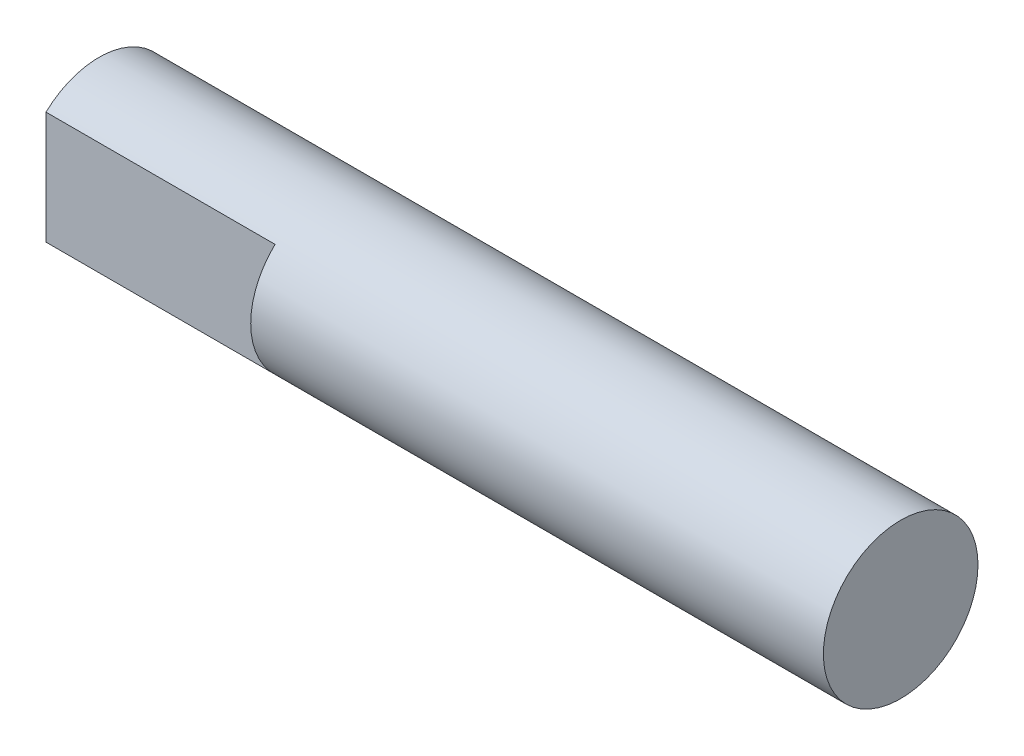
ISO-10303-21;
HEADER;
FILE_DESCRIPTION(('STEP AP214'),'2;1');
FILE_NAME('part.step','',(''),(''),'','','');
FILE_SCHEMA(('AUTOMOTIVE_DESIGN { 1 0 10303 214 1 1 1 1 }'));
ENDSEC;
DATA;
#1=APPLICATION_CONTEXT('core data for automotive mechanical design processes');
#2=APPLICATION_PROTOCOL_DEFINITION('international standard','automotive_design',2000,#1);
#3=PRODUCT_CONTEXT('',#1,'mechanical');
#4=PRODUCT('Part','Part','',(#3));
#5=PRODUCT_RELATED_PRODUCT_CATEGORY('part','',(#4));
#6=PRODUCT_DEFINITION_FORMATION('','',#4);
#7=PRODUCT_DEFINITION_CONTEXT('part definition',#1,'design');
#8=PRODUCT_DEFINITION('design','',#6,#7);
#9=PRODUCT_DEFINITION_SHAPE('','',#8);
#10=(LENGTH_UNIT() NAMED_UNIT(*) SI_UNIT(.MILLI.,.METRE.));
#11=(NAMED_UNIT(*) PLANE_ANGLE_UNIT() SI_UNIT($,.RADIAN.));
#12=(NAMED_UNIT(*) SI_UNIT($,.STERADIAN.) SOLID_ANGLE_UNIT());
#13=UNCERTAINTY_MEASURE_WITH_UNIT(LENGTH_MEASURE(1.E-05),#10,'distance_accuracy_value','');
#14=(GEOMETRIC_REPRESENTATION_CONTEXT(3) GLOBAL_UNCERTAINTY_ASSIGNED_CONTEXT((#13)) GLOBAL_UNIT_ASSIGNED_CONTEXT((#10,
#11,#12)) REPRESENTATION_CONTEXT('',''));
#15=CARTESIAN_POINT('',(0.,0.,0.));
#16=DIRECTION('',(0.,0.,1.));
#17=DIRECTION('',(1.,0.,0.));
#18=AXIS2_PLACEMENT_3D('',#15,#16,#17);
#19=CARTESIAN_POINT('',(18.5,0.,0.));
#20=DIRECTION('',(-1.,0.,0.));
#21=DIRECTION('',(0.,0.,1.));
#22=AXIS2_PLACEMENT_3D('',#19,#20,#21);
#23=CYLINDRICAL_SURFACE('',#22,2.7);
#24=DIRECTION('',(-1.,0.,0.));
#25=VECTOR('',#24,1.);
#26=CARTESIAN_POINT('',(-10.5,1.96659604392971,1.85));
#27=LINE('',#26,#25);
#28=CARTESIAN_POINT('',(-10.5,1.96659604392971,1.85));
#29=VERTEX_POINT('',#28);
#30=CARTESIAN_POINT('',(-18.5,1.96659604392971,1.85));
#31=VERTEX_POINT('',#30);
#32=EDGE_CURVE('E61',#29,#31,#27,.T.);
#33=ORIENTED_EDGE('',*,*,#32,.F.);
#34=CARTESIAN_POINT('',(-10.5,0.,0.));
#35=DIRECTION('',(1.,0.,0.));
#36=DIRECTION('',(0.,0.,-1.));
#37=AXIS2_PLACEMENT_3D('',#34,#35,#36);
#38=CIRCLE('',#37,2.7);
#39=CARTESIAN_POINT('',(-10.5,-1.96659604392971,1.85));
#40=VERTEX_POINT('',#39);
#41=EDGE_CURVE('E84',#29,#40,#38,.T.);
#42=ORIENTED_EDGE('',*,*,#41,.T.);
#43=DIRECTION('',(-1.,0.,0.));
#44=VECTOR('',#43,1.);
#45=CARTESIAN_POINT('',(-10.5,-1.96659604392971,1.85));
#46=LINE('',#45,#44);
#47=CARTESIAN_POINT('',(-18.5,-1.96659604392971,1.85));
#48=VERTEX_POINT('',#47);
#49=EDGE_CURVE('E81',#40,#48,#46,.T.);
#50=ORIENTED_EDGE('',*,*,#49,.T.);
#51=CARTESIAN_POINT('',(-18.5,0.,0.));
#52=DIRECTION('',(1.,0.,0.));
#53=DIRECTION('',(0.,0.,-1.));
#54=AXIS2_PLACEMENT_3D('',#51,#52,#53);
#55=CIRCLE('',#54,2.7);
#56=CARTESIAN_POINT('',(-18.5,-1.96659604392971,-1.85));
#57=VERTEX_POINT('',#56);
#58=EDGE_CURVE('E46',#48,#57,#55,.T.);
#59=ORIENTED_EDGE('',*,*,#58,.T.);
#60=DIRECTION('',(-1.,0.,0.));
#61=VECTOR('',#60,1.);
#62=CARTESIAN_POINT('',(-10.5,-1.96659604392971,-1.85));
#63=LINE('',#62,#61);
#64=CARTESIAN_POINT('',(-10.5,-1.96659604392971,-1.85));
#65=VERTEX_POINT('',#64);
#66=EDGE_CURVE('E53',#65,#57,#63,.T.);
#67=ORIENTED_EDGE('',*,*,#66,.F.);
#68=CARTESIAN_POINT('',(-10.5,0.,0.));
#69=DIRECTION('',(1.,0.,0.));
#70=DIRECTION('',(0.,0.,-1.));
#71=AXIS2_PLACEMENT_3D('',#68,#69,#70);
#72=CIRCLE('',#71,2.7);
#73=CARTESIAN_POINT('',(-10.5,1.96659604392971,-1.85));
#74=VERTEX_POINT('',#73);
#75=EDGE_CURVE('E97',#65,#74,#72,.T.);
#76=ORIENTED_EDGE('',*,*,#75,.T.);
#77=DIRECTION('',(-1.,0.,0.));
#78=VECTOR('',#77,1.);
#79=CARTESIAN_POINT('',(-10.5,1.96659604392971,-1.85));
#80=LINE('',#79,#78);
#81=CARTESIAN_POINT('',(-18.5,1.96659604392971,-1.85));
#82=VERTEX_POINT('',#81);
#83=EDGE_CURVE('E105',#74,#82,#80,.T.);
#84=ORIENTED_EDGE('',*,*,#83,.T.);
#85=EDGE_CURVE('E11',#82,#31,#55,.T.);
#86=ORIENTED_EDGE('',*,*,#85,.T.);
#87=EDGE_LOOP('',(#33,#42,#50,#59,#67,#76,#84,#86));
#88=FACE_BOUND('',#87,.T.);
#89=CARTESIAN_POINT('',(9.49999999999999,0.,0.));
#90=DIRECTION('',(1.,0.,0.));
#91=DIRECTION('',(0.,0.,-1.));
#92=AXIS2_PLACEMENT_3D('',#89,#90,#91);
#93=CIRCLE('',#92,2.7);
#94=CARTESIAN_POINT('',(9.49999999999999,0.,-2.7));
#95=VERTEX_POINT('',#94);
#96=EDGE_CURVE('E113',#95,#95,#93,.F.);
#97=ORIENTED_EDGE('',*,*,#96,.T.);
#98=EDGE_LOOP('',(#97));
#99=FACE_BOUND('',#98,.T.);
#100=ADVANCED_FACE('F39',(#88,#99),#23,.T.);
#101=CARTESIAN_POINT('',(-18.5,0.,0.));
#102=DIRECTION('',(1.,0.,0.));
#103=DIRECTION('',(0.,0.,-1.));
#104=AXIS2_PLACEMENT_3D('',#101,#102,#103);
#105=PLANE('',#104);
#106=CARTESIAN_POINT('',(-18.5,0.,0.));
#107=DIRECTION('',(1.,0.,0.));
#108=DIRECTION('',(0.,0.,-1.));
#109=AXIS2_PLACEMENT_3D('',#106,#107,#108);
#110=CIRCLE('',#109,1.);
#111=CARTESIAN_POINT('',(-18.5,0.,-1.));
#112=VERTEX_POINT('',#111);
#113=EDGE_CURVE('E110',#112,#112,#110,.T.);
#114=ORIENTED_EDGE('',*,*,#113,.T.);
#115=EDGE_LOOP('',(#114));
#116=FACE_BOUND('',#115,.T.);
#117=DIRECTION('',(0.,1.,0.));
#118=VECTOR('',#117,1.);
#119=CARTESIAN_POINT('',(-18.5,1.96659604392971,1.85));
#120=LINE('',#119,#118);
#121=EDGE_CURVE('E88',#48,#31,#120,.T.);
#122=ORIENTED_EDGE('',*,*,#121,.T.);
#123=ORIENTED_EDGE('',*,*,#85,.F.);
#124=DIRECTION('',(0.,-1.,0.));
#125=VECTOR('',#124,1.);
#126=CARTESIAN_POINT('',(-18.5,1.96659604392971,-1.85));
#127=LINE('',#126,#125);
#128=EDGE_CURVE('E101',#82,#57,#127,.T.);
#129=ORIENTED_EDGE('',*,*,#128,.T.);
#130=ORIENTED_EDGE('',*,*,#58,.F.);
#131=EDGE_LOOP('',(#122,#123,#129,#130));
#132=FACE_BOUND('',#131,.T.);
#133=ADVANCED_FACE('F130',(#116,#132),#105,.F.);
#134=CARTESIAN_POINT('',(-10.5,1.96659604392971,-1.85));
#135=DIRECTION('',(0.,0.,-1.));
#136=DIRECTION('',(-1.,0.,0.));
#137=AXIS2_PLACEMENT_3D('',#134,#135,#136);
#138=PLANE('',#137);
#139=ORIENTED_EDGE('',*,*,#128,.F.);
#140=ORIENTED_EDGE('',*,*,#83,.F.);
#141=DIRECTION('',(0.,-1.,0.));
#142=VECTOR('',#141,1.);
#143=CARTESIAN_POINT('',(-10.5,1.96659604392971,-1.85));
#144=LINE('',#143,#142);
#145=EDGE_CURVE('E100',#74,#65,#144,.T.);
#146=ORIENTED_EDGE('',*,*,#145,.T.);
#147=ORIENTED_EDGE('',*,*,#66,.T.);
#148=EDGE_LOOP('',(#139,#140,#146,#147));
#149=FACE_BOUND('',#148,.T.);
#150=ADVANCED_FACE('F134',(#149),#138,.T.);
#151=CARTESIAN_POINT('',(-10.5,0.,0.));
#152=DIRECTION('',(-1.,0.,0.));
#153=DIRECTION('',(0.,0.,-1.));
#154=AXIS2_PLACEMENT_3D('',#151,#152,#153);
#155=PLANE('',#154);
#156=ORIENTED_EDGE('',*,*,#75,.F.);
#157=ORIENTED_EDGE('',*,*,#145,.F.);
#158=EDGE_LOOP('',(#156,#157));
#159=FACE_BOUND('',#158,.T.);
#160=ADVANCED_FACE('F139',(#159),#155,.T.);
#161=CARTESIAN_POINT('',(-10.5,1.96659604392971,1.85));
#162=DIRECTION('',(0.,0.,1.));
#163=DIRECTION('',(1.,0.,0.));
#164=AXIS2_PLACEMENT_3D('',#161,#162,#163);
#165=PLANE('',#164);
#166=ORIENTED_EDGE('',*,*,#121,.F.);
#167=ORIENTED_EDGE('',*,*,#49,.F.);
#168=DIRECTION('',(0.,1.,0.));
#169=VECTOR('',#168,1.);
#170=CARTESIAN_POINT('',(-10.5,1.96659604392971,1.85));
#171=LINE('',#170,#169);
#172=EDGE_CURVE('E77',#40,#29,#171,.T.);
#173=ORIENTED_EDGE('',*,*,#172,.T.);
#174=ORIENTED_EDGE('',*,*,#32,.T.);
#175=EDGE_LOOP('',(#166,#167,#173,#174));
#176=FACE_BOUND('',#175,.T.);
#177=ADVANCED_FACE('F79',(#176),#165,.T.);
#178=CARTESIAN_POINT('',(-10.5,0.,0.));
#179=DIRECTION('',(-1.,0.,0.));
#180=DIRECTION('',(0.,0.,-1.));
#181=AXIS2_PLACEMENT_3D('',#178,#179,#180);
#182=PLANE('',#181);
#183=ORIENTED_EDGE('',*,*,#41,.F.);
#184=ORIENTED_EDGE('',*,*,#172,.F.);
#185=EDGE_LOOP('',(#183,#184));
#186=FACE_BOUND('',#185,.T.);
#187=ADVANCED_FACE('F86',(#186),#182,.T.);
#188=CARTESIAN_POINT('',(-12.5,0.,0.));
#189=DIRECTION('',(-1.,0.,0.));
#190=DIRECTION('',(0.,0.,1.));
#191=AXIS2_PLACEMENT_3D('',#188,#189,#190);
#192=CYLINDRICAL_SURFACE('',#191,1.);
#193=CARTESIAN_POINT('',(-12.5,0.,0.));
#194=DIRECTION('',(1.,0.,0.));
#195=DIRECTION('',(0.,0.,-1.));
#196=AXIS2_PLACEMENT_3D('',#193,#194,#195);
#197=CIRCLE('',#196,1.);
#198=CARTESIAN_POINT('',(-12.5,0.,-1.));
#199=VERTEX_POINT('',#198);
#200=EDGE_CURVE('E104',#199,#199,#197,.T.);
#201=ORIENTED_EDGE('',*,*,#200,.T.);
#202=EDGE_LOOP('',(#201));
#203=FACE_BOUND('',#202,.T.);
#204=ORIENTED_EDGE('',*,*,#113,.F.);
#205=EDGE_LOOP('',(#204));
#206=FACE_BOUND('',#205,.T.);
#207=ADVANCED_FACE('F127',(#203,#206),#192,.F.);
#208=CARTESIAN_POINT('',(-12.5,0.,0.));
#209=DIRECTION('',(-1.,0.,0.));
#210=DIRECTION('',(0.,0.,-1.));
#211=AXIS2_PLACEMENT_3D('',#208,#209,#210);
#212=PLANE('',#211);
#213=ORIENTED_EDGE('',*,*,#200,.F.);
#214=EDGE_LOOP('',(#213));
#215=FACE_BOUND('',#214,.T.);
#216=ADVANCED_FACE('F121',(#215),#212,.T.);
#217=CARTESIAN_POINT('',(9.49999999999999,-2.7,-2.701));
#218=DIRECTION('',(1.,0.,0.));
#219=DIRECTION('',(0.,0.,-1.));
#220=AXIS2_PLACEMENT_3D('',#217,#218,#219);
#221=PLANE('',#220);
#222=ORIENTED_EDGE('',*,*,#96,.F.);
#223=EDGE_LOOP('',(#222));
#224=FACE_BOUND('',#223,.T.);
#225=ADVANCED_FACE('F119',(#224),#221,.T.);
#226=CLOSED_SHELL('',(#100,#133,#150,#160,#177,#187,#207,#216,#225));
#227=MANIFOLD_SOLID_BREP('B2',#226);
#228=ADVANCED_BREP_SHAPE_REPRESENTATION('',(#18,#227),#14);
#229=SHAPE_DEFINITION_REPRESENTATION(#9,#228);
ENDSEC;
END-ISO-10303-21;
